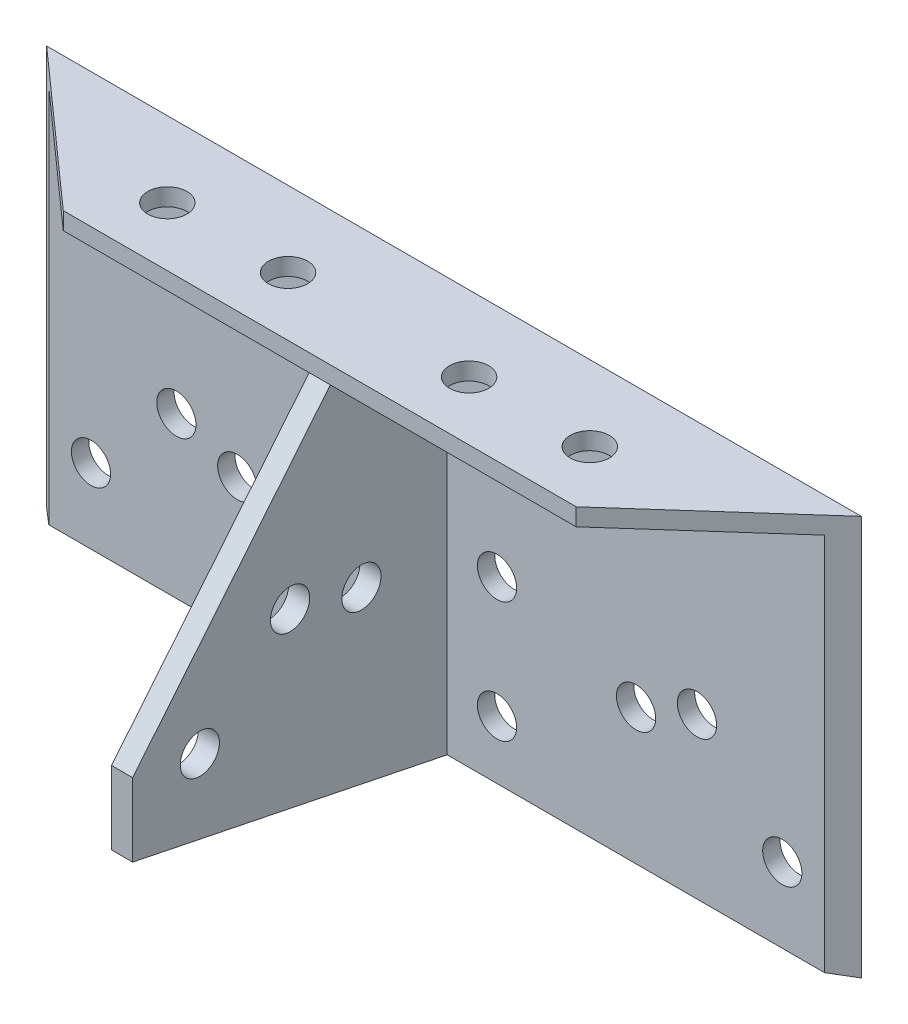
ISO-10303-21;
HEADER;
FILE_DESCRIPTION(('STEP AP214'),'2;1');
FILE_NAME('part.step','',(''),(''),'','','');
FILE_SCHEMA(('AUTOMOTIVE_DESIGN { 1 0 10303 214 1 1 1 1 }'));
ENDSEC;
DATA;
#1=APPLICATION_CONTEXT('core data for automotive mechanical design processes');
#2=APPLICATION_PROTOCOL_DEFINITION('international standard','automotive_design',2000,#1);
#3=PRODUCT_CONTEXT('',#1,'mechanical');
#4=PRODUCT('Part','Part','',(#3));
#5=PRODUCT_RELATED_PRODUCT_CATEGORY('part','',(#4));
#6=PRODUCT_DEFINITION_FORMATION('','',#4);
#7=PRODUCT_DEFINITION_CONTEXT('part definition',#1,'design');
#8=PRODUCT_DEFINITION('design','',#6,#7);
#9=PRODUCT_DEFINITION_SHAPE('','',#8);
#10=(LENGTH_UNIT() NAMED_UNIT(*) SI_UNIT(.MILLI.,.METRE.));
#11=(NAMED_UNIT(*) PLANE_ANGLE_UNIT() SI_UNIT($,.RADIAN.));
#12=(NAMED_UNIT(*) SI_UNIT($,.STERADIAN.) SOLID_ANGLE_UNIT());
#13=UNCERTAINTY_MEASURE_WITH_UNIT(LENGTH_MEASURE(1.E-05),#10,'distance_accuracy_value','');
#14=(GEOMETRIC_REPRESENTATION_CONTEXT(3) GLOBAL_UNCERTAINTY_ASSIGNED_CONTEXT((#13)) GLOBAL_UNIT_ASSIGNED_CONTEXT((#10,
#11,#12)) REPRESENTATION_CONTEXT('',''));
#15=CARTESIAN_POINT('',(0.,0.,0.));
#16=DIRECTION('',(0.,0.,1.));
#17=DIRECTION('',(1.,0.,0.));
#18=AXIS2_PLACEMENT_3D('',#15,#16,#17);
#19=CARTESIAN_POINT('',(0.,265.,11.5));
#20=DIRECTION('',(0.,0.,-1.));
#21=DIRECTION('',(-1.,0.,0.));
#22=AXIS2_PLACEMENT_3D('',#19,#20,#21);
#23=PLANE('',#22);
#24=CARTESIAN_POINT('',(230.,41.,11.5));
#25=DIRECTION('',(0.,0.,1.));
#26=DIRECTION('',(1.,0.,0.));
#27=AXIS2_PLACEMENT_3D('',#24,#25,#26);
#28=CIRCLE('',#27,13.);
#29=CARTESIAN_POINT('',(243.,41.,11.5));
#30=VERTEX_POINT('',#29);
#31=EDGE_CURVE('E656',#30,#30,#28,.T.);
#32=ORIENTED_EDGE('',*,*,#31,.F.);
#33=EDGE_LOOP('',(#32));
#34=FACE_BOUND('',#33,.T.);
#35=CARTESIAN_POINT('',(97.4659453904821,108.465945390483,11.5));
#36=DIRECTION('',(0.,0.,1.));
#37=DIRECTION('',(1.,0.,0.));
#38=AXIS2_PLACEMENT_3D('',#35,#36,#37);
#39=CIRCLE('',#38,13.);
#40=CARTESIAN_POINT('',(110.465945390482,108.465945390483,11.5));
#41=VERTEX_POINT('',#40);
#42=EDGE_CURVE('E315',#41,#41,#39,.T.);
#43=ORIENTED_EDGE('',*,*,#42,.F.);
#44=EDGE_LOOP('',(#43));
#45=FACE_BOUND('',#44,.T.);
#46=CARTESIAN_POINT('',(40.8974028955581,51.897402895559,11.5));
#47=DIRECTION('',(0.,0.,1.));
#48=DIRECTION('',(1.,0.,0.));
#49=AXIS2_PLACEMENT_3D('',#46,#47,#48);
#50=CIRCLE('',#49,13.);
#51=CARTESIAN_POINT('',(53.8974028955582,51.897402895559,11.5));
#52=VERTEX_POINT('',#51);
#53=EDGE_CURVE('E316',#52,#52,#50,.T.);
#54=ORIENTED_EDGE('',*,*,#53,.F.);
#55=EDGE_LOOP('',(#54));
#56=FACE_BOUND('',#55,.T.);
#57=CARTESIAN_POINT('',(230.,121.,11.5));
#58=DIRECTION('',(0.,0.,1.));
#59=DIRECTION('',(1.,0.,0.));
#60=AXIS2_PLACEMENT_3D('',#57,#58,#59);
#61=CIRCLE('',#60,13.);
#62=CARTESIAN_POINT('',(243.,121.,11.5));
#63=VERTEX_POINT('',#62);
#64=EDGE_CURVE('E634',#63,#63,#61,.T.);
#65=ORIENTED_EDGE('',*,*,#64,.F.);
#66=EDGE_LOOP('',(#65));
#67=FACE_BOUND('',#66,.T.);
#68=CARTESIAN_POINT('',(137.829012361263,92.2615340814046,11.5));
#69=DIRECTION('',(0.,0.,1.));
#70=DIRECTION('',(1.,0.,0.));
#71=AXIS2_PLACEMENT_3D('',#68,#69,#70);
#72=CIRCLE('',#71,13.);
#73=CARTESIAN_POINT('',(150.829012361263,92.2615340814046,11.5));
#74=VERTEX_POINT('',#73);
#75=EDGE_CURVE('E637',#74,#74,#72,.T.);
#76=ORIENTED_EDGE('',*,*,#75,.F.);
#77=EDGE_LOOP('',(#76));
#78=FACE_BOUND('',#77,.T.);
#79=DIRECTION('',(0.,-1.,0.));
#80=VECTOR('',#79,1.);
#81=CARTESIAN_POINT('',(12.9213483146067,265.,11.5));
#82=LINE('',#81,#80);
#83=CARTESIAN_POINT('',(12.9213483146067,253.5,11.5));
#84=VERTEX_POINT('',#83);
#85=CARTESIAN_POINT('',(12.9213483146067,2.35227272727279,11.5));
#86=VERTEX_POINT('',#85);
#87=EDGE_CURVE('E172',#84,#86,#82,.T.);
#88=ORIENTED_EDGE('',*,*,#87,.T.);
#89=DIRECTION('',(1.,0.,0.));
#90=VECTOR('',#89,1.);
#91=CARTESIAN_POINT('',(0.,2.35227272727279,11.5));
#92=LINE('',#91,#90);
#93=CARTESIAN_POINT('',(263.,2.35227272727273,11.5));
#94=VERTEX_POINT('',#93);
#95=EDGE_CURVE('E331',#86,#94,#92,.T.);
#96=ORIENTED_EDGE('',*,*,#95,.T.);
#97=DIRECTION('',(0.,-1.,0.));
#98=VECTOR('',#97,1.);
#99=CARTESIAN_POINT('',(263.,253.5,11.5));
#100=LINE('',#99,#98);
#101=CARTESIAN_POINT('',(263.,253.5,11.5));
#102=VERTEX_POINT('',#101);
#103=EDGE_CURVE('E330',#102,#94,#100,.T.);
#104=ORIENTED_EDGE('',*,*,#103,.F.);
#105=DIRECTION('',(1.,0.,0.));
#106=VECTOR('',#105,1.);
#107=CARTESIAN_POINT('',(0.,253.5,11.5));
#108=LINE('',#107,#106);
#109=EDGE_CURVE('E154',#84,#102,#108,.T.);
#110=ORIENTED_EDGE('',*,*,#109,.F.);
#111=EDGE_LOOP('',(#88,#96,#104,#110));
#112=FACE_BOUND('',#111,.T.);
#113=ADVANCED_FACE('F37',(#34,#45,#56,#67,#78,#112),#23,.F.);
#114=CARTESIAN_POINT('',(442.534054609518,108.465945390483,11.5));
#115=DIRECTION('',(0.,0.,1.));
#116=DIRECTION('',(-1.,0.,0.));
#117=AXIS2_PLACEMENT_3D('',#114,#115,#116);
#118=CIRCLE('',#117,13.);
#119=CARTESIAN_POINT('',(429.534054609518,108.465945390483,11.5));
#120=VERTEX_POINT('',#119);
#121=EDGE_CURVE('E643',#120,#120,#118,.T.);
#122=ORIENTED_EDGE('',*,*,#121,.F.);
#123=EDGE_LOOP('',(#122));
#124=FACE_BOUND('',#123,.T.);
#125=CARTESIAN_POINT('',(310.,121.,11.5));
#126=DIRECTION('',(0.,0.,1.));
#127=DIRECTION('',(-1.,0.,0.));
#128=AXIS2_PLACEMENT_3D('',#125,#126,#127);
#129=CIRCLE('',#128,13.);
#130=CARTESIAN_POINT('',(297.,121.,11.5));
#131=VERTEX_POINT('',#130);
#132=EDGE_CURVE('E640',#131,#131,#129,.T.);
#133=ORIENTED_EDGE('',*,*,#132,.F.);
#134=EDGE_LOOP('',(#133));
#135=FACE_BOUND('',#134,.T.);
#136=CARTESIAN_POINT('',(499.102597104442,51.8974028955591,11.5));
#137=DIRECTION('',(0.,0.,1.));
#138=DIRECTION('',(-1.,0.,0.));
#139=AXIS2_PLACEMENT_3D('',#136,#137,#138);
#140=CIRCLE('',#139,13.0000000000001);
#141=CARTESIAN_POINT('',(486.102597104442,51.8974028955591,11.5));
#142=VERTEX_POINT('',#141);
#143=EDGE_CURVE('E664',#142,#142,#140,.T.);
#144=ORIENTED_EDGE('',*,*,#143,.F.);
#145=EDGE_LOOP('',(#144));
#146=FACE_BOUND('',#145,.T.);
#147=CARTESIAN_POINT('',(310.,41.,11.5));
#148=DIRECTION('',(0.,0.,1.));
#149=DIRECTION('',(-1.,0.,0.));
#150=AXIS2_PLACEMENT_3D('',#147,#148,#149);
#151=CIRCLE('',#150,13.);
#152=CARTESIAN_POINT('',(297.,41.,11.5));
#153=VERTEX_POINT('',#152);
#154=EDGE_CURVE('E651',#153,#153,#151,.T.);
#155=ORIENTED_EDGE('',*,*,#154,.F.);
#156=EDGE_LOOP('',(#155));
#157=FACE_BOUND('',#156,.T.);
#158=CARTESIAN_POINT('',(402.170987638737,92.2615340814046,11.5));
#159=DIRECTION('',(0.,0.,1.));
#160=DIRECTION('',(-1.,0.,0.));
#161=AXIS2_PLACEMENT_3D('',#158,#159,#160);
#162=CIRCLE('',#161,13.);
#163=CARTESIAN_POINT('',(389.170987638737,92.2615340814046,11.5));
#164=VERTEX_POINT('',#163);
#165=EDGE_CURVE('E166',#164,#164,#162,.T.);
#166=ORIENTED_EDGE('',*,*,#165,.F.);
#167=EDGE_LOOP('',(#166));
#168=FACE_BOUND('',#167,.T.);
#169=DIRECTION('',(0.,1.,0.));
#170=VECTOR('',#169,1.);
#171=CARTESIAN_POINT('',(277.,253.5,11.5));
#172=LINE('',#171,#170);
#173=CARTESIAN_POINT('',(277.,2.35227272727274,11.5000000000001));
#174=VERTEX_POINT('',#173);
#175=CARTESIAN_POINT('',(277.,253.5,11.5));
#176=VERTEX_POINT('',#175);
#177=EDGE_CURVE('E233',#174,#176,#172,.T.);
#178=ORIENTED_EDGE('',*,*,#177,.F.);
#179=DIRECTION('',(-1.,0.,0.));
#180=VECTOR('',#179,1.);
#181=CARTESIAN_POINT('',(540.,2.35227272727274,11.5000000000001));
#182=LINE('',#181,#180);
#183=CARTESIAN_POINT('',(527.078651685393,2.35227272727274,11.5000000000001));
#184=VERTEX_POINT('',#183);
#185=EDGE_CURVE('E139',#184,#174,#182,.T.);
#186=ORIENTED_EDGE('',*,*,#185,.F.);
#187=DIRECTION('',(0.,1.,0.));
#188=VECTOR('',#187,1.);
#189=CARTESIAN_POINT('',(527.078651685393,265.,11.5));
#190=LINE('',#189,#188);
#191=CARTESIAN_POINT('',(527.078651685393,253.5,11.5));
#192=VERTEX_POINT('',#191);
#193=EDGE_CURVE('E137',#184,#192,#190,.T.);
#194=ORIENTED_EDGE('',*,*,#193,.T.);
#195=EDGE_CURVE('E159',#176,#192,#108,.T.);
#196=ORIENTED_EDGE('',*,*,#195,.F.);
#197=EDGE_LOOP('',(#178,#186,#194,#196));
#198=FACE_BOUND('',#197,.T.);
#199=ADVANCED_FACE('F275',(#124,#135,#146,#157,#168,#198),#23,.F.);
#200=CARTESIAN_POINT('',(0.,253.5,89.));
#201=DIRECTION('',(0.,1.,0.));
#202=DIRECTION('',(0.,0.,1.));
#203=AXIS2_PLACEMENT_3D('',#200,#201,#202);
#204=PLANE('',#203);
#205=CARTESIAN_POINT('',(210.,253.5,50.));
#206=DIRECTION('',(0.,1.,0.));
#207=DIRECTION('',(0.,0.,1.));
#208=AXIS2_PLACEMENT_3D('',#205,#206,#207);
#209=CIRCLE('',#208,13.);
#210=CARTESIAN_POINT('',(210.,253.5,63.));
#211=VERTEX_POINT('',#210);
#212=EDGE_CURVE('E192',#211,#211,#209,.T.);
#213=ORIENTED_EDGE('',*,*,#212,.T.);
#214=EDGE_LOOP('',(#213));
#215=FACE_BOUND('',#214,.T.);
#216=CARTESIAN_POINT('',(130.,253.5,50.));
#217=DIRECTION('',(0.,1.,0.));
#218=DIRECTION('',(0.,0.,1.));
#219=AXIS2_PLACEMENT_3D('',#216,#217,#218);
#220=CIRCLE('',#219,13.);
#221=CARTESIAN_POINT('',(130.,253.5,63.));
#222=VERTEX_POINT('',#221);
#223=EDGE_CURVE('E244',#222,#222,#220,.T.);
#224=ORIENTED_EDGE('',*,*,#223,.T.);
#225=EDGE_LOOP('',(#224));
#226=FACE_BOUND('',#225,.T.);
#227=DIRECTION('',(0.,0.,-1.));
#228=VECTOR('',#227,1.);
#229=CARTESIAN_POINT('',(263.,253.5,220.));
#230=LINE('',#229,#228);
#231=CARTESIAN_POINT('',(263.,253.5,89.));
#232=VERTEX_POINT('',#231);
#233=EDGE_CURVE('E216',#232,#102,#230,.T.);
#234=ORIENTED_EDGE('',*,*,#233,.F.);
#235=DIRECTION('',(1.,0.,0.));
#236=VECTOR('',#235,1.);
#237=CARTESIAN_POINT('',(0.,253.5,89.));
#238=LINE('',#237,#236);
#239=CARTESIAN_POINT('',(100.,253.5,89.));
#240=VERTEX_POINT('',#239);
#241=EDGE_CURVE('E201',#240,#232,#238,.T.);
#242=ORIENTED_EDGE('',*,*,#241,.F.);
#243=DIRECTION('',(-0.746997038573461,0.,-0.66482736433038));
#244=VECTOR('',#243,1.);
#245=CARTESIAN_POINT('',(44.199542436248,253.5,39.3375927682607));
#246=LINE('',#245,#244);
#247=EDGE_CURVE('E197',#240,#84,#246,.T.);
#248=ORIENTED_EDGE('',*,*,#247,.T.);
#249=ORIENTED_EDGE('',*,*,#109,.T.);
#250=EDGE_LOOP('',(#234,#242,#248,#249));
#251=FACE_BOUND('',#250,.T.);
#252=ADVANCED_FACE('F224',(#215,#226,#251),#204,.F.);
#253=CARTESIAN_POINT('',(410.,253.5,50.));
#254=DIRECTION('',(0.,1.,0.));
#255=DIRECTION('',(0.,0.,1.));
#256=AXIS2_PLACEMENT_3D('',#253,#254,#255);
#257=CIRCLE('',#256,13.);
#258=CARTESIAN_POINT('',(410.,253.5,63.));
#259=VERTEX_POINT('',#258);
#260=EDGE_CURVE('E241',#259,#259,#257,.T.);
#261=ORIENTED_EDGE('',*,*,#260,.T.);
#262=EDGE_LOOP('',(#261));
#263=FACE_BOUND('',#262,.T.);
#264=CARTESIAN_POINT('',(330.,253.5,50.));
#265=DIRECTION('',(0.,1.,0.));
#266=DIRECTION('',(0.,0.,1.));
#267=AXIS2_PLACEMENT_3D('',#264,#265,#266);
#268=CIRCLE('',#267,13.);
#269=CARTESIAN_POINT('',(330.,253.5,62.9999999999999));
#270=VERTEX_POINT('',#269);
#271=EDGE_CURVE('E173',#270,#270,#268,.T.);
#272=ORIENTED_EDGE('',*,*,#271,.T.);
#273=EDGE_LOOP('',(#272));
#274=FACE_BOUND('',#273,.T.);
#275=DIRECTION('',(0.,0.,-1.));
#276=VECTOR('',#275,1.);
#277=CARTESIAN_POINT('',(277.,253.5,220.));
#278=LINE('',#277,#276);
#279=CARTESIAN_POINT('',(277.,253.5,89.));
#280=VERTEX_POINT('',#279);
#281=EDGE_CURVE('E226',#280,#176,#278,.T.);
#282=ORIENTED_EDGE('',*,*,#281,.T.);
#283=ORIENTED_EDGE('',*,*,#195,.T.);
#284=DIRECTION('',(-0.746997038573461,0.,0.66482736433038));
#285=VECTOR('',#284,1.);
#286=CARTESIAN_POINT('',(194.477986719491,253.5,307.514591819653));
#287=LINE('',#286,#285);
#288=CARTESIAN_POINT('',(440.,253.5,89.));
#289=VERTEX_POINT('',#288);
#290=EDGE_CURVE('E179',#192,#289,#287,.T.);
#291=ORIENTED_EDGE('',*,*,#290,.T.);
#292=EDGE_CURVE('E158',#280,#289,#238,.T.);
#293=ORIENTED_EDGE('',*,*,#292,.F.);
#294=EDGE_LOOP('',(#282,#283,#291,#293));
#295=FACE_BOUND('',#294,.T.);
#296=ADVANCED_FACE('F186',(#263,#274,#295),#204,.F.);
#297=CARTESIAN_POINT('',(0.,265.,0.));
#298=DIRECTION('',(0.,0.,-1.));
#299=DIRECTION('',(-1.,0.,0.));
#300=AXIS2_PLACEMENT_3D('',#297,#298,#299);
#301=PLANE('',#300);
#302=CARTESIAN_POINT('',(442.534054609518,108.465945390483,0.));
#303=DIRECTION('',(0.,0.,1.));
#304=DIRECTION('',(-1.,0.,0.));
#305=AXIS2_PLACEMENT_3D('',#302,#303,#304);
#306=CIRCLE('',#305,13.);
#307=CARTESIAN_POINT('',(429.534054609518,108.465945390483,0.));
#308=VERTEX_POINT('',#307);
#309=EDGE_CURVE('E298',#308,#308,#306,.T.);
#310=ORIENTED_EDGE('',*,*,#309,.T.);
#311=EDGE_LOOP('',(#310));
#312=FACE_BOUND('',#311,.T.);
#313=CARTESIAN_POINT('',(310.,121.,0.));
#314=DIRECTION('',(0.,0.,1.));
#315=DIRECTION('',(-1.,0.,0.));
#316=AXIS2_PLACEMENT_3D('',#313,#314,#315);
#317=CIRCLE('',#316,13.);
#318=CARTESIAN_POINT('',(297.,121.,0.));
#319=VERTEX_POINT('',#318);
#320=EDGE_CURVE('E302',#319,#319,#317,.T.);
#321=ORIENTED_EDGE('',*,*,#320,.T.);
#322=EDGE_LOOP('',(#321));
#323=FACE_BOUND('',#322,.T.);
#324=CARTESIAN_POINT('',(230.,41.,0.));
#325=DIRECTION('',(0.,0.,1.));
#326=DIRECTION('',(1.,0.,0.));
#327=AXIS2_PLACEMENT_3D('',#324,#325,#326);
#328=CIRCLE('',#327,13.);
#329=CARTESIAN_POINT('',(243.,41.,0.));
#330=VERTEX_POINT('',#329);
#331=EDGE_CURVE('E306',#330,#330,#328,.T.);
#332=ORIENTED_EDGE('',*,*,#331,.T.);
#333=EDGE_LOOP('',(#332));
#334=FACE_BOUND('',#333,.T.);
#335=CARTESIAN_POINT('',(499.102597104442,51.8974028955591,0.));
#336=DIRECTION('',(0.,0.,1.));
#337=DIRECTION('',(-1.,0.,0.));
#338=AXIS2_PLACEMENT_3D('',#335,#336,#337);
#339=CIRCLE('',#338,13.0000000000001);
#340=CARTESIAN_POINT('',(486.102597104442,51.8974028955591,0.));
#341=VERTEX_POINT('',#340);
#342=EDGE_CURVE('E310',#341,#341,#339,.T.);
#343=ORIENTED_EDGE('',*,*,#342,.T.);
#344=EDGE_LOOP('',(#343));
#345=FACE_BOUND('',#344,.T.);
#346=CARTESIAN_POINT('',(97.4659453904821,108.465945390483,0.));
#347=DIRECTION('',(0.,0.,1.));
#348=DIRECTION('',(1.,0.,0.));
#349=AXIS2_PLACEMENT_3D('',#346,#347,#348);
#350=CIRCLE('',#349,13.);
#351=CARTESIAN_POINT('',(110.465945390482,108.465945390483,0.));
#352=VERTEX_POINT('',#351);
#353=EDGE_CURVE('E313',#352,#352,#350,.T.);
#354=ORIENTED_EDGE('',*,*,#353,.T.);
#355=EDGE_LOOP('',(#354));
#356=FACE_BOUND('',#355,.T.);
#357=DIRECTION('',(0.,-1.,0.));
#358=VECTOR('',#357,1.);
#359=CARTESIAN_POINT('',(0.,0.,0.));
#360=LINE('',#359,#358);
#361=CARTESIAN_POINT('',(0.,265.,0.));
#362=VERTEX_POINT('',#361);
#363=CARTESIAN_POINT('',(0.,0.,0.));
#364=VERTEX_POINT('',#363);
#365=EDGE_CURVE('E130',#362,#364,#360,.T.);
#366=ORIENTED_EDGE('',*,*,#365,.F.);
#367=DIRECTION('',(-1.,0.,0.));
#368=VECTOR('',#367,1.);
#369=CARTESIAN_POINT('',(0.,265.,0.));
#370=LINE('',#369,#368);
#371=CARTESIAN_POINT('',(540.,265.,0.));
#372=VERTEX_POINT('',#371);
#373=EDGE_CURVE('E145',#372,#362,#370,.T.);
#374=ORIENTED_EDGE('',*,*,#373,.F.);
#375=DIRECTION('',(0.,1.,0.));
#376=VECTOR('',#375,1.);
#377=CARTESIAN_POINT('',(540.,0.,0.));
#378=LINE('',#377,#376);
#379=CARTESIAN_POINT('',(540.,0.,0.));
#380=VERTEX_POINT('',#379);
#381=EDGE_CURVE('E129',#380,#372,#378,.T.);
#382=ORIENTED_EDGE('',*,*,#381,.F.);
#383=DIRECTION('',(1.,0.,0.));
#384=VECTOR('',#383,1.);
#385=CARTESIAN_POINT('',(0.,0.,0.));
#386=LINE('',#385,#384);
#387=EDGE_CURVE('E118',#364,#380,#386,.T.);
#388=ORIENTED_EDGE('',*,*,#387,.F.);
#389=EDGE_LOOP('',(#366,#374,#382,#388));
#390=FACE_BOUND('',#389,.T.);
#391=CARTESIAN_POINT('',(40.8974028955581,51.897402895559,0.));
#392=DIRECTION('',(0.,0.,1.));
#393=DIRECTION('',(1.,0.,0.));
#394=AXIS2_PLACEMENT_3D('',#391,#392,#393);
#395=CIRCLE('',#394,13.);
#396=CARTESIAN_POINT('',(53.8974028955582,51.897402895559,0.));
#397=VERTEX_POINT('',#396);
#398=EDGE_CURVE('E321',#397,#397,#395,.T.);
#399=ORIENTED_EDGE('',*,*,#398,.T.);
#400=EDGE_LOOP('',(#399));
#401=FACE_BOUND('',#400,.T.);
#402=CARTESIAN_POINT('',(230.,121.,0.));
#403=DIRECTION('',(0.,0.,1.));
#404=DIRECTION('',(1.,0.,0.));
#405=AXIS2_PLACEMENT_3D('',#402,#403,#404);
#406=CIRCLE('',#405,13.);
#407=CARTESIAN_POINT('',(243.,121.,0.));
#408=VERTEX_POINT('',#407);
#409=EDGE_CURVE('E659',#408,#408,#406,.T.);
#410=ORIENTED_EDGE('',*,*,#409,.T.);
#411=EDGE_LOOP('',(#410));
#412=FACE_BOUND('',#411,.T.);
#413=CARTESIAN_POINT('',(310.,41.,0.));
#414=DIRECTION('',(0.,0.,1.));
#415=DIRECTION('',(-1.,0.,0.));
#416=AXIS2_PLACEMENT_3D('',#413,#414,#415);
#417=CIRCLE('',#416,13.);
#418=CARTESIAN_POINT('',(297.,41.,0.));
#419=VERTEX_POINT('',#418);
#420=EDGE_CURVE('E649',#419,#419,#417,.T.);
#421=ORIENTED_EDGE('',*,*,#420,.T.);
#422=EDGE_LOOP('',(#421));
#423=FACE_BOUND('',#422,.T.);
#424=CARTESIAN_POINT('',(137.829012361263,92.2615340814046,0.));
#425=DIRECTION('',(0.,0.,1.));
#426=DIRECTION('',(1.,0.,0.));
#427=AXIS2_PLACEMENT_3D('',#424,#425,#426);
#428=CIRCLE('',#427,13.);
#429=CARTESIAN_POINT('',(150.829012361263,92.2615340814046,0.));
#430=VERTEX_POINT('',#429);
#431=EDGE_CURVE('E638',#430,#430,#428,.T.);
#432=ORIENTED_EDGE('',*,*,#431,.T.);
#433=EDGE_LOOP('',(#432));
#434=FACE_BOUND('',#433,.T.);
#435=CARTESIAN_POINT('',(402.170987638737,92.2615340814046,0.));
#436=DIRECTION('',(0.,0.,1.));
#437=DIRECTION('',(-1.,0.,0.));
#438=AXIS2_PLACEMENT_3D('',#435,#436,#437);
#439=CIRCLE('',#438,13.);
#440=CARTESIAN_POINT('',(389.170987638737,92.2615340814046,0.));
#441=VERTEX_POINT('',#440);
#442=EDGE_CURVE('E206',#441,#441,#439,.T.);
#443=ORIENTED_EDGE('',*,*,#442,.T.);
#444=EDGE_LOOP('',(#443));
#445=FACE_BOUND('',#444,.T.);
#446=ADVANCED_FACE('F142',(#312,#323,#334,#345,#356,#390,#401,#412,#423,#434,#445),#301,.T.);
#447=CARTESIAN_POINT('',(0.,265.,11.5));
#448=DIRECTION('',(0.,-1.,0.));
#449=DIRECTION('',(0.,0.,-1.));
#450=AXIS2_PLACEMENT_3D('',#447,#448,#449);
#451=PLANE('',#450);
#452=CARTESIAN_POINT('',(330.,265.,50.));
#453=DIRECTION('',(0.,1.,0.));
#454=DIRECTION('',(0.,0.,-1.));
#455=AXIS2_PLACEMENT_3D('',#452,#453,#454);
#456=CIRCLE('',#455,13.);
#457=CARTESIAN_POINT('',(330.,265.,37.));
#458=VERTEX_POINT('',#457);
#459=EDGE_CURVE('E229',#458,#458,#456,.T.);
#460=ORIENTED_EDGE('',*,*,#459,.F.);
#461=EDGE_LOOP('',(#460));
#462=FACE_BOUND('',#461,.T.);
#463=CARTESIAN_POINT('',(410.,265.,50.));
#464=DIRECTION('',(0.,1.,0.));
#465=DIRECTION('',(0.,0.,-1.));
#466=AXIS2_PLACEMENT_3D('',#463,#464,#465);
#467=CIRCLE('',#466,13.);
#468=CARTESIAN_POINT('',(410.,265.,37.));
#469=VERTEX_POINT('',#468);
#470=EDGE_CURVE('E238',#469,#469,#467,.T.);
#471=ORIENTED_EDGE('',*,*,#470,.F.);
#472=EDGE_LOOP('',(#471));
#473=FACE_BOUND('',#472,.T.);
#474=CARTESIAN_POINT('',(130.,265.,50.));
#475=DIRECTION('',(0.,1.,0.));
#476=DIRECTION('',(0.,0.,1.));
#477=AXIS2_PLACEMENT_3D('',#474,#475,#476);
#478=CIRCLE('',#477,13.);
#479=CARTESIAN_POINT('',(130.,265.,63.));
#480=VERTEX_POINT('',#479);
#481=EDGE_CURVE('E242',#480,#480,#478,.T.);
#482=ORIENTED_EDGE('',*,*,#481,.F.);
#483=EDGE_LOOP('',(#482));
#484=FACE_BOUND('',#483,.T.);
#485=CARTESIAN_POINT('',(210.,265.,50.));
#486=DIRECTION('',(0.,1.,0.));
#487=DIRECTION('',(0.,0.,1.));
#488=AXIS2_PLACEMENT_3D('',#485,#486,#487);
#489=CIRCLE('',#488,13.);
#490=CARTESIAN_POINT('',(210.,265.,63.));
#491=VERTEX_POINT('',#490);
#492=EDGE_CURVE('E245',#491,#491,#489,.T.);
#493=ORIENTED_EDGE('',*,*,#492,.F.);
#494=EDGE_LOOP('',(#493));
#495=FACE_BOUND('',#494,.T.);
#496=DIRECTION('',(-1.,0.,0.));
#497=VECTOR('',#496,1.);
#498=CARTESIAN_POINT('',(0.,265.,89.));
#499=LINE('',#498,#497);
#500=CARTESIAN_POINT('',(440.,265.,89.));
#501=VERTEX_POINT('',#500);
#502=CARTESIAN_POINT('',(100.,265.,89.));
#503=VERTEX_POINT('',#502);
#504=EDGE_CURVE('E164',#501,#503,#499,.T.);
#505=ORIENTED_EDGE('',*,*,#504,.F.);
#506=DIRECTION('',(-0.746997038573461,0.,0.66482736433038));
#507=VECTOR('',#506,1.);
#508=CARTESIAN_POINT('',(540.,265.,0.));
#509=LINE('',#508,#507);
#510=EDGE_CURVE('E180',#372,#501,#509,.T.);
#511=ORIENTED_EDGE('',*,*,#510,.F.);
#512=ORIENTED_EDGE('',*,*,#373,.T.);
#513=DIRECTION('',(-0.746997038573461,0.,-0.66482736433038));
#514=VECTOR('',#513,1.);
#515=CARTESIAN_POINT('',(0.,265.,0.));
#516=LINE('',#515,#514);
#517=EDGE_CURVE('E190',#503,#362,#516,.T.);
#518=ORIENTED_EDGE('',*,*,#517,.F.);
#519=EDGE_LOOP('',(#505,#511,#512,#518));
#520=FACE_BOUND('',#519,.T.);
#521=ADVANCED_FACE('F39',(#462,#473,#484,#495,#520),#451,.F.);
#522=CARTESIAN_POINT('',(97.4659453904821,108.465945390483,11.5));
#523=DIRECTION('',(0.,0.,-1.));
#524=DIRECTION('',(-1.,0.,0.));
#525=AXIS2_PLACEMENT_3D('',#522,#523,#524);
#526=CYLINDRICAL_SURFACE('',#525,13.);
#527=ORIENTED_EDGE('',*,*,#42,.T.);
#528=EDGE_LOOP('',(#527));
#529=FACE_BOUND('',#528,.T.);
#530=ORIENTED_EDGE('',*,*,#353,.F.);
#531=EDGE_LOOP('',(#530));
#532=FACE_BOUND('',#531,.T.);
#533=ADVANCED_FACE('F285',(#529,#532),#526,.F.);
#534=CARTESIAN_POINT('',(40.8974028955581,51.897402895559,11.5));
#535=DIRECTION('',(0.,0.,-1.));
#536=DIRECTION('',(-1.,0.,0.));
#537=AXIS2_PLACEMENT_3D('',#534,#535,#536);
#538=CYLINDRICAL_SURFACE('',#537,13.);
#539=ORIENTED_EDGE('',*,*,#53,.T.);
#540=EDGE_LOOP('',(#539));
#541=FACE_BOUND('',#540,.T.);
#542=ORIENTED_EDGE('',*,*,#398,.F.);
#543=EDGE_LOOP('',(#542));
#544=FACE_BOUND('',#543,.T.);
#545=ADVANCED_FACE('F587',(#541,#544),#538,.F.);
#546=CARTESIAN_POINT('',(499.102597104442,51.8974028955591,11.5));
#547=DIRECTION('',(0.,0.,-1.));
#548=DIRECTION('',(-1.,0.,0.));
#549=AXIS2_PLACEMENT_3D('',#546,#547,#548);
#550=CYLINDRICAL_SURFACE('',#549,13.0000000000001);
#551=ORIENTED_EDGE('',*,*,#143,.T.);
#552=EDGE_LOOP('',(#551));
#553=FACE_BOUND('',#552,.T.);
#554=ORIENTED_EDGE('',*,*,#342,.F.);
#555=EDGE_LOOP('',(#554));
#556=FACE_BOUND('',#555,.T.);
#557=ADVANCED_FACE('F577',(#553,#556),#550,.F.);
#558=CARTESIAN_POINT('',(230.,121.,11.5));
#559=DIRECTION('',(0.,0.,-1.));
#560=DIRECTION('',(-1.,0.,0.));
#561=AXIS2_PLACEMENT_3D('',#558,#559,#560);
#562=CYLINDRICAL_SURFACE('',#561,13.);
#563=ORIENTED_EDGE('',*,*,#64,.T.);
#564=EDGE_LOOP('',(#563));
#565=FACE_BOUND('',#564,.T.);
#566=ORIENTED_EDGE('',*,*,#409,.F.);
#567=EDGE_LOOP('',(#566));
#568=FACE_BOUND('',#567,.T.);
#569=ADVANCED_FACE('F567',(#565,#568),#562,.F.);
#570=CARTESIAN_POINT('',(230.,41.,11.5));
#571=DIRECTION('',(0.,0.,-1.));
#572=DIRECTION('',(-1.,0.,0.));
#573=AXIS2_PLACEMENT_3D('',#570,#571,#572);
#574=CYLINDRICAL_SURFACE('',#573,13.);
#575=ORIENTED_EDGE('',*,*,#31,.T.);
#576=EDGE_LOOP('',(#575));
#577=FACE_BOUND('',#576,.T.);
#578=ORIENTED_EDGE('',*,*,#331,.F.);
#579=EDGE_LOOP('',(#578));
#580=FACE_BOUND('',#579,.T.);
#581=ADVANCED_FACE('F557',(#577,#580),#574,.F.);
#582=CARTESIAN_POINT('',(310.,41.,11.5));
#583=DIRECTION('',(0.,0.,-1.));
#584=DIRECTION('',(-1.,0.,0.));
#585=AXIS2_PLACEMENT_3D('',#582,#583,#584);
#586=CYLINDRICAL_SURFACE('',#585,13.);
#587=ORIENTED_EDGE('',*,*,#154,.T.);
#588=EDGE_LOOP('',(#587));
#589=FACE_BOUND('',#588,.T.);
#590=ORIENTED_EDGE('',*,*,#420,.F.);
#591=EDGE_LOOP('',(#590));
#592=FACE_BOUND('',#591,.T.);
#593=ADVANCED_FACE('F547',(#589,#592),#586,.F.);
#594=CARTESIAN_POINT('',(310.,121.,11.5));
#595=DIRECTION('',(0.,0.,-1.));
#596=DIRECTION('',(-1.,0.,0.));
#597=AXIS2_PLACEMENT_3D('',#594,#595,#596);
#598=CYLINDRICAL_SURFACE('',#597,13.);
#599=ORIENTED_EDGE('',*,*,#132,.T.);
#600=EDGE_LOOP('',(#599));
#601=FACE_BOUND('',#600,.T.);
#602=ORIENTED_EDGE('',*,*,#320,.F.);
#603=EDGE_LOOP('',(#602));
#604=FACE_BOUND('',#603,.T.);
#605=ADVANCED_FACE('F537',(#601,#604),#598,.F.);
#606=CARTESIAN_POINT('',(137.829012361263,92.2615340814046,11.5));
#607=DIRECTION('',(0.,0.,-1.));
#608=DIRECTION('',(-1.,0.,0.));
#609=AXIS2_PLACEMENT_3D('',#606,#607,#608);
#610=CYLINDRICAL_SURFACE('',#609,13.);
#611=ORIENTED_EDGE('',*,*,#75,.T.);
#612=EDGE_LOOP('',(#611));
#613=FACE_BOUND('',#612,.T.);
#614=ORIENTED_EDGE('',*,*,#431,.F.);
#615=EDGE_LOOP('',(#614));
#616=FACE_BOUND('',#615,.T.);
#617=ADVANCED_FACE('F527',(#613,#616),#610,.F.);
#618=CARTESIAN_POINT('',(442.534054609518,108.465945390483,11.5));
#619=DIRECTION('',(0.,0.,-1.));
#620=DIRECTION('',(-1.,0.,0.));
#621=AXIS2_PLACEMENT_3D('',#618,#619,#620);
#622=CYLINDRICAL_SURFACE('',#621,13.);
#623=ORIENTED_EDGE('',*,*,#121,.T.);
#624=EDGE_LOOP('',(#623));
#625=FACE_BOUND('',#624,.T.);
#626=ORIENTED_EDGE('',*,*,#309,.F.);
#627=EDGE_LOOP('',(#626));
#628=FACE_BOUND('',#627,.T.);
#629=ADVANCED_FACE('F517',(#625,#628),#622,.F.);
#630=CARTESIAN_POINT('',(402.170987638737,92.2615340814046,11.5));
#631=DIRECTION('',(0.,0.,-1.));
#632=DIRECTION('',(-1.,0.,0.));
#633=AXIS2_PLACEMENT_3D('',#630,#631,#632);
#634=CYLINDRICAL_SURFACE('',#633,13.);
#635=ORIENTED_EDGE('',*,*,#165,.T.);
#636=EDGE_LOOP('',(#635));
#637=FACE_BOUND('',#636,.T.);
#638=ORIENTED_EDGE('',*,*,#442,.F.);
#639=EDGE_LOOP('',(#638));
#640=FACE_BOUND('',#639,.T.);
#641=ADVANCED_FACE('F458',(#637,#640),#634,.F.);
#642=CARTESIAN_POINT('',(0.,253.5,89.));
#643=DIRECTION('',(0.,0.,1.));
#644=DIRECTION('',(1.,0.,0.));
#645=AXIS2_PLACEMENT_3D('',#642,#643,#644);
#646=PLANE('',#645);
#647=DIRECTION('',(0.,-1.,0.));
#648=VECTOR('',#647,1.);
#649=CARTESIAN_POINT('',(440.,253.5,89.));
#650=LINE('',#649,#648);
#651=EDGE_CURVE('E153',#501,#289,#650,.T.);
#652=ORIENTED_EDGE('',*,*,#651,.F.);
#653=ORIENTED_EDGE('',*,*,#504,.T.);
#654=DIRECTION('',(0.,1.,0.));
#655=VECTOR('',#654,1.);
#656=CARTESIAN_POINT('',(100.,253.5,89.));
#657=LINE('',#656,#655);
#658=EDGE_CURVE('E147',#240,#503,#657,.T.);
#659=ORIENTED_EDGE('',*,*,#658,.F.);
#660=ORIENTED_EDGE('',*,*,#241,.T.);
#661=EDGE_CURVE('E203',#232,#280,#238,.T.);
#662=ORIENTED_EDGE('',*,*,#661,.T.);
#663=ORIENTED_EDGE('',*,*,#292,.T.);
#664=EDGE_LOOP('',(#652,#653,#659,#660,#662,#663));
#665=FACE_BOUND('',#664,.T.);
#666=ADVANCED_FACE('F207',(#665),#646,.T.);
#667=CARTESIAN_POINT('',(0.,-2.50000000145967E-05,0.));
#668=DIRECTION('',(0.66482736433038,0.,-0.746997038573461));
#669=DIRECTION('',(-0.746997038573461,0.,-0.66482736433038));
#670=AXIS2_PLACEMENT_3D('',#667,#668,#669);
#671=PLANE('',#670);
#672=ORIENTED_EDGE('',*,*,#365,.T.);
#673=DIRECTION('',(0.740184431111828,0.134747211209222,0.658764143689527));
#674=VECTOR('',#673,1.);
#675=CARTESIAN_POINT('',(-2.49344469740945E-06,-4.53920282011262E-07,-2.21916578069441E-06));
#676=LINE('',#675,#674);
#677=EDGE_CURVE('E124',#364,#86,#676,.T.);
#678=ORIENTED_EDGE('',*,*,#677,.T.);
#679=ORIENTED_EDGE('',*,*,#87,.F.);
#680=ORIENTED_EDGE('',*,*,#247,.F.);
#681=ORIENTED_EDGE('',*,*,#658,.T.);
#682=ORIENTED_EDGE('',*,*,#517,.T.);
#683=EDGE_LOOP('',(#672,#678,#679,#680,#681,#682));
#684=FACE_BOUND('',#683,.T.);
#685=ADVANCED_FACE('F325',(#684),#671,.F.);
#686=CARTESIAN_POINT('',(540.,-2.50000000145967E-05,0.));
#687=DIRECTION('',(-0.66482736433038,0.,-0.746997038573461));
#688=DIRECTION('',(-0.746997038573461,0.,0.66482736433038));
#689=AXIS2_PLACEMENT_3D('',#686,#687,#688);
#690=PLANE('',#689);
#691=ORIENTED_EDGE('',*,*,#193,.F.);
#692=DIRECTION('',(0.740184431111828,-0.134747211209221,-0.658764143689527));
#693=VECTOR('',#692,1.);
#694=CARTESIAN_POINT('',(540.000002493445,-4.53920273481593E-07,-2.21916578146556E-06));
#695=LINE('',#694,#693);
#696=EDGE_CURVE('E121',#184,#380,#695,.T.);
#697=ORIENTED_EDGE('',*,*,#696,.T.);
#698=ORIENTED_EDGE('',*,*,#381,.T.);
#699=ORIENTED_EDGE('',*,*,#510,.T.);
#700=ORIENTED_EDGE('',*,*,#651,.T.);
#701=ORIENTED_EDGE('',*,*,#290,.F.);
#702=EDGE_LOOP('',(#691,#697,#698,#699,#700,#701));
#703=FACE_BOUND('',#702,.T.);
#704=ADVANCED_FACE('F134',(#703),#690,.F.);
#705=CARTESIAN_POINT('',(210.,0.,50.));
#706=DIRECTION('',(0.,1.,0.));
#707=DIRECTION('',(0.,0.,1.));
#708=AXIS2_PLACEMENT_3D('',#705,#706,#707);
#709=CYLINDRICAL_SURFACE('',#708,13.);
#710=ORIENTED_EDGE('',*,*,#492,.T.);
#711=EDGE_LOOP('',(#710));
#712=FACE_BOUND('',#711,.T.);
#713=ORIENTED_EDGE('',*,*,#212,.F.);
#714=EDGE_LOOP('',(#713));
#715=FACE_BOUND('',#714,.T.);
#716=ADVANCED_FACE('F271',(#712,#715),#709,.F.);
#717=CARTESIAN_POINT('',(130.,0.,50.));
#718=DIRECTION('',(0.,1.,0.));
#719=DIRECTION('',(0.,0.,1.));
#720=AXIS2_PLACEMENT_3D('',#717,#718,#719);
#721=CYLINDRICAL_SURFACE('',#720,13.);
#722=ORIENTED_EDGE('',*,*,#481,.T.);
#723=EDGE_LOOP('',(#722));
#724=FACE_BOUND('',#723,.T.);
#725=ORIENTED_EDGE('',*,*,#223,.F.);
#726=EDGE_LOOP('',(#725));
#727=FACE_BOUND('',#726,.T.);
#728=ADVANCED_FACE('F262',(#724,#727),#721,.F.);
#729=CARTESIAN_POINT('',(410.,0.,50.));
#730=DIRECTION('',(0.,1.,0.));
#731=DIRECTION('',(0.,0.,1.));
#732=AXIS2_PLACEMENT_3D('',#729,#730,#731);
#733=CYLINDRICAL_SURFACE('',#732,13.);
#734=ORIENTED_EDGE('',*,*,#470,.T.);
#735=EDGE_LOOP('',(#734));
#736=FACE_BOUND('',#735,.T.);
#737=ORIENTED_EDGE('',*,*,#260,.F.);
#738=EDGE_LOOP('',(#737));
#739=FACE_BOUND('',#738,.T.);
#740=ADVANCED_FACE('F259',(#736,#739),#733,.F.);
#741=CARTESIAN_POINT('',(330.,0.,50.));
#742=DIRECTION('',(0.,1.,0.));
#743=DIRECTION('',(0.,0.,1.));
#744=AXIS2_PLACEMENT_3D('',#741,#742,#743);
#745=CYLINDRICAL_SURFACE('',#744,13.);
#746=ORIENTED_EDGE('',*,*,#459,.T.);
#747=EDGE_LOOP('',(#746));
#748=FACE_BOUND('',#747,.T.);
#749=ORIENTED_EDGE('',*,*,#271,.F.);
#750=EDGE_LOOP('',(#749));
#751=FACE_BOUND('',#750,.T.);
#752=ADVANCED_FACE('F261',(#748,#751),#745,.F.);
#753=CARTESIAN_POINT('',(263.,253.5,220.));
#754=DIRECTION('',(1.,0.,0.));
#755=DIRECTION('',(0.,1.,0.));
#756=AXIS2_PLACEMENT_3D('',#753,#754,#755);
#757=PLANE('',#756);
#758=CARTESIAN_POINT('',(263.,126.911974174471,68.3772941125762));
#759=DIRECTION('',(1.,0.,0.));
#760=DIRECTION('',(0.,1.,0.));
#761=AXIS2_PLACEMENT_3D('',#758,#759,#760);
#762=CIRCLE('',#761,13.);
#763=CARTESIAN_POINT('',(263.,139.911974174471,68.3772941125762));
#764=VERTEX_POINT('',#763);
#765=EDGE_CURVE('E351',#764,#764,#762,.T.);
#766=ORIENTED_EDGE('',*,*,#765,.T.);
#767=EDGE_LOOP('',(#766));
#768=FACE_BOUND('',#767,.T.);
#769=CARTESIAN_POINT('',(263.,84.9866525092177,175.46262178759));
#770=DIRECTION('',(1.,0.,0.));
#771=DIRECTION('',(0.,1.,0.));
#772=AXIS2_PLACEMENT_3D('',#769,#770,#771);
#773=CIRCLE('',#772,13.);
#774=CARTESIAN_POINT('',(263.,97.9866525092177,175.46262178759));
#775=VERTEX_POINT('',#774);
#776=EDGE_CURVE('E340',#775,#775,#773,.T.);
#777=ORIENTED_EDGE('',*,*,#776,.T.);
#778=EDGE_LOOP('',(#777));
#779=FACE_BOUND('',#778,.T.);
#780=CARTESIAN_POINT('',(263.,138.142814540616,115.676148082481));
#781=DIRECTION('',(1.,0.,0.));
#782=DIRECTION('',(0.,1.,0.));
#783=AXIS2_PLACEMENT_3D('',#780,#781,#782);
#784=CIRCLE('',#783,13.);
#785=CARTESIAN_POINT('',(263.,151.142814540616,115.676148082481));
#786=VERTEX_POINT('',#785);
#787=EDGE_CURVE('E332',#786,#786,#784,.T.);
#788=ORIENTED_EDGE('',*,*,#787,.T.);
#789=EDGE_LOOP('',(#788));
#790=FACE_BOUND('',#789,.T.);
#791=ORIENTED_EDGE('',*,*,#103,.T.);
#792=DIRECTION('',(0.,0.200396236148707,0.979714932282566));
#793=VECTOR('',#792,1.);
#794=CARTESIAN_POINT('',(263.,53.3730788299455,260.935052057511));
#795=LINE('',#794,#793);
#796=CARTESIAN_POINT('',(263.,45.,220.));
#797=VERTEX_POINT('',#796);
#798=EDGE_CURVE('E348',#94,#797,#795,.T.);
#799=ORIENTED_EDGE('',*,*,#798,.T.);
#800=DIRECTION('',(0.,-1.,0.));
#801=VECTOR('',#800,1.);
#802=CARTESIAN_POINT('',(263.,253.5,220.));
#803=LINE('',#802,#801);
#804=CARTESIAN_POINT('',(263.,93.5,220.));
#805=VERTEX_POINT('',#804);
#806=EDGE_CURVE('E220',#805,#797,#803,.T.);
#807=ORIENTED_EDGE('',*,*,#806,.F.);
#808=DIRECTION('',(0.,0.773741794125483,-0.633501093940239));
#809=VECTOR('',#808,1.);
#810=CARTESIAN_POINT('',(263.,189.288218236243,141.573396319076));
#811=LINE('',#810,#809);
#812=EDGE_CURVE('E59',#805,#232,#811,.T.);
#813=ORIENTED_EDGE('',*,*,#812,.T.);
#814=ORIENTED_EDGE('',*,*,#233,.T.);
#815=EDGE_LOOP('',(#791,#799,#807,#813,#814));
#816=FACE_BOUND('',#815,.T.);
#817=ADVANCED_FACE('F215',(#768,#779,#790,#816),#757,.F.);
#818=CARTESIAN_POINT('',(277.,253.5,220.));
#819=DIRECTION('',(-1.,0.,0.));
#820=DIRECTION('',(0.,0.,1.));
#821=AXIS2_PLACEMENT_3D('',#818,#819,#820);
#822=PLANE('',#821);
#823=CARTESIAN_POINT('',(277.,126.911974174471,68.3772941125762));
#824=DIRECTION('',(1.,0.,0.));
#825=DIRECTION('',(0.,0.,-1.));
#826=AXIS2_PLACEMENT_3D('',#823,#824,#825);
#827=CIRCLE('',#826,13.);
#828=CARTESIAN_POINT('',(277.,126.911974174471,55.3772941125761));
#829=VERTEX_POINT('',#828);
#830=EDGE_CURVE('E138',#829,#829,#827,.T.);
#831=ORIENTED_EDGE('',*,*,#830,.F.);
#832=EDGE_LOOP('',(#831));
#833=FACE_BOUND('',#832,.T.);
#834=CARTESIAN_POINT('',(277.,84.9866525092177,175.46262178759));
#835=DIRECTION('',(1.,0.,0.));
#836=DIRECTION('',(0.,0.,-1.));
#837=AXIS2_PLACEMENT_3D('',#834,#835,#836);
#838=CIRCLE('',#837,13.);
#839=CARTESIAN_POINT('',(277.,84.9866525092177,162.46262178759));
#840=VERTEX_POINT('',#839);
#841=EDGE_CURVE('E221',#840,#840,#838,.T.);
#842=ORIENTED_EDGE('',*,*,#841,.F.);
#843=EDGE_LOOP('',(#842));
#844=FACE_BOUND('',#843,.T.);
#845=CARTESIAN_POINT('',(277.,138.142814540616,115.676148082481));
#846=DIRECTION('',(1.,0.,0.));
#847=DIRECTION('',(0.,0.,-1.));
#848=AXIS2_PLACEMENT_3D('',#845,#846,#847);
#849=CIRCLE('',#848,13.);
#850=CARTESIAN_POINT('',(277.,138.142814540616,102.676148082481));
#851=VERTEX_POINT('',#850);
#852=EDGE_CURVE('E334',#851,#851,#849,.T.);
#853=ORIENTED_EDGE('',*,*,#852,.F.);
#854=EDGE_LOOP('',(#853));
#855=FACE_BOUND('',#854,.T.);
#856=DIRECTION('',(0.,1.,0.));
#857=VECTOR('',#856,1.);
#858=CARTESIAN_POINT('',(277.,253.5,220.));
#859=LINE('',#858,#857);
#860=CARTESIAN_POINT('',(277.,45.,220.));
#861=VERTEX_POINT('',#860);
#862=CARTESIAN_POINT('',(277.,93.5,220.));
#863=VERTEX_POINT('',#862);
#864=EDGE_CURVE('E227',#861,#863,#859,.T.);
#865=ORIENTED_EDGE('',*,*,#864,.F.);
#866=DIRECTION('',(0.,0.200396236148707,0.979714932282565));
#867=VECTOR('',#866,1.);
#868=CARTESIAN_POINT('',(277.,45.,220.));
#869=LINE('',#868,#867);
#870=EDGE_CURVE('E51',#174,#861,#869,.T.);
#871=ORIENTED_EDGE('',*,*,#870,.F.);
#872=ORIENTED_EDGE('',*,*,#177,.T.);
#873=ORIENTED_EDGE('',*,*,#281,.F.);
#874=DIRECTION('',(0.,0.773741794125482,-0.633501093940239));
#875=VECTOR('',#874,1.);
#876=CARTESIAN_POINT('',(277.,253.5,89.));
#877=LINE('',#876,#875);
#878=EDGE_CURVE('E209',#863,#280,#877,.T.);
#879=ORIENTED_EDGE('',*,*,#878,.F.);
#880=EDGE_LOOP('',(#865,#871,#872,#873,#879));
#881=FACE_BOUND('',#880,.T.);
#882=ADVANCED_FACE('F360',(#833,#844,#855,#881),#822,.F.);
#883=CARTESIAN_POINT('',(263.,0.,220.));
#884=DIRECTION('',(0.,0.,1.));
#885=DIRECTION('',(1.,0.,0.));
#886=AXIS2_PLACEMENT_3D('',#883,#884,#885);
#887=PLANE('',#886);
#888=DIRECTION('',(-1.,0.,0.));
#889=VECTOR('',#888,1.);
#890=CARTESIAN_POINT('',(263.,45.,220.));
#891=LINE('',#890,#889);
#892=EDGE_CURVE('E11',#861,#797,#891,.T.);
#893=ORIENTED_EDGE('',*,*,#892,.F.);
#894=ORIENTED_EDGE('',*,*,#864,.T.);
#895=DIRECTION('',(1.,0.,0.));
#896=VECTOR('',#895,1.);
#897=CARTESIAN_POINT('',(263.,93.5,220.));
#898=LINE('',#897,#896);
#899=EDGE_CURVE('E45',#805,#863,#898,.T.);
#900=ORIENTED_EDGE('',*,*,#899,.F.);
#901=ORIENTED_EDGE('',*,*,#806,.T.);
#902=EDGE_LOOP('',(#893,#894,#900,#901));
#903=FACE_BOUND('',#902,.T.);
#904=ADVANCED_FACE('F362',(#903),#887,.T.);
#905=CARTESIAN_POINT('',(0.,138.142814540616,115.676148082481));
#906=DIRECTION('',(1.,0.,0.));
#907=DIRECTION('',(0.,0.,-1.));
#908=AXIS2_PLACEMENT_3D('',#905,#906,#907);
#909=CYLINDRICAL_SURFACE('',#908,13.);
#910=ORIENTED_EDGE('',*,*,#852,.T.);
#911=EDGE_LOOP('',(#910));
#912=FACE_BOUND('',#911,.T.);
#913=ORIENTED_EDGE('',*,*,#787,.F.);
#914=EDGE_LOOP('',(#913));
#915=FACE_BOUND('',#914,.T.);
#916=ADVANCED_FACE('F364',(#912,#915),#909,.F.);
#917=CARTESIAN_POINT('',(0.,84.9866525092177,175.46262178759));
#918=DIRECTION('',(1.,0.,0.));
#919=DIRECTION('',(0.,0.,-1.));
#920=AXIS2_PLACEMENT_3D('',#917,#918,#919);
#921=CYLINDRICAL_SURFACE('',#920,13.);
#922=ORIENTED_EDGE('',*,*,#841,.T.);
#923=EDGE_LOOP('',(#922));
#924=FACE_BOUND('',#923,.T.);
#925=ORIENTED_EDGE('',*,*,#776,.F.);
#926=EDGE_LOOP('',(#925));
#927=FACE_BOUND('',#926,.T.);
#928=ADVANCED_FACE('F370',(#924,#927),#921,.F.);
#929=CARTESIAN_POINT('',(0.,253.5,89.));
#930=DIRECTION('',(0.,-0.633501093940239,-0.773741794125482));
#931=DIRECTION('',(0.,0.773741794125483,-0.633501093940239));
#932=AXIS2_PLACEMENT_3D('',#929,#930,#931);
#933=PLANE('',#932);
#934=ORIENTED_EDGE('',*,*,#899,.T.);
#935=ORIENTED_EDGE('',*,*,#878,.T.);
#936=ORIENTED_EDGE('',*,*,#661,.F.);
#937=ORIENTED_EDGE('',*,*,#812,.F.);
#938=EDGE_LOOP('',(#934,#935,#936,#937));
#939=FACE_BOUND('',#938,.T.);
#940=ADVANCED_FACE('F208',(#939),#933,.F.);
#941=CARTESIAN_POINT('',(0.,45.,220.));
#942=DIRECTION('',(0.,0.979714932282566,-0.200396236148707));
#943=DIRECTION('',(0.,0.200396236148707,0.979714932282566));
#944=AXIS2_PLACEMENT_3D('',#941,#942,#943);
#945=PLANE('',#944);
#946=ORIENTED_EDGE('',*,*,#387,.T.);
#947=ORIENTED_EDGE('',*,*,#696,.F.);
#948=ORIENTED_EDGE('',*,*,#185,.T.);
#949=ORIENTED_EDGE('',*,*,#870,.T.);
#950=ORIENTED_EDGE('',*,*,#892,.T.);
#951=ORIENTED_EDGE('',*,*,#798,.F.);
#952=ORIENTED_EDGE('',*,*,#95,.F.);
#953=ORIENTED_EDGE('',*,*,#677,.F.);
#954=EDGE_LOOP('',(#946,#947,#948,#949,#950,#951,#952,#953));
#955=FACE_BOUND('',#954,.T.);
#956=ADVANCED_FACE('F120',(#955),#945,.F.);
#957=CARTESIAN_POINT('',(0.,126.911974174471,68.3772941125762));
#958=DIRECTION('',(1.,0.,0.));
#959=DIRECTION('',(0.,0.,-1.));
#960=AXIS2_PLACEMENT_3D('',#957,#958,#959);
#961=CYLINDRICAL_SURFACE('',#960,13.);
#962=ORIENTED_EDGE('',*,*,#830,.T.);
#963=EDGE_LOOP('',(#962));
#964=FACE_BOUND('',#963,.T.);
#965=ORIENTED_EDGE('',*,*,#765,.F.);
#966=EDGE_LOOP('',(#965));
#967=FACE_BOUND('',#966,.T.);
#968=ADVANCED_FACE('F397',(#964,#967),#961,.F.);
#969=CLOSED_SHELL('',(#113,#199,#252,#296,#446,#521,#533,#545,#557,#569,#581,#593,#605,#617,
#629,#641,#666,#685,#704,#716,#728,#740,#752,#817,#882,#904,#916,#928,#940,#956,#968));
#970=MANIFOLD_SOLID_BREP('B2',#969);
#971=ADVANCED_BREP_SHAPE_REPRESENTATION('',(#18,#970),#14);
#972=SHAPE_DEFINITION_REPRESENTATION(#9,#971);
ENDSEC;
END-ISO-10303-21;
